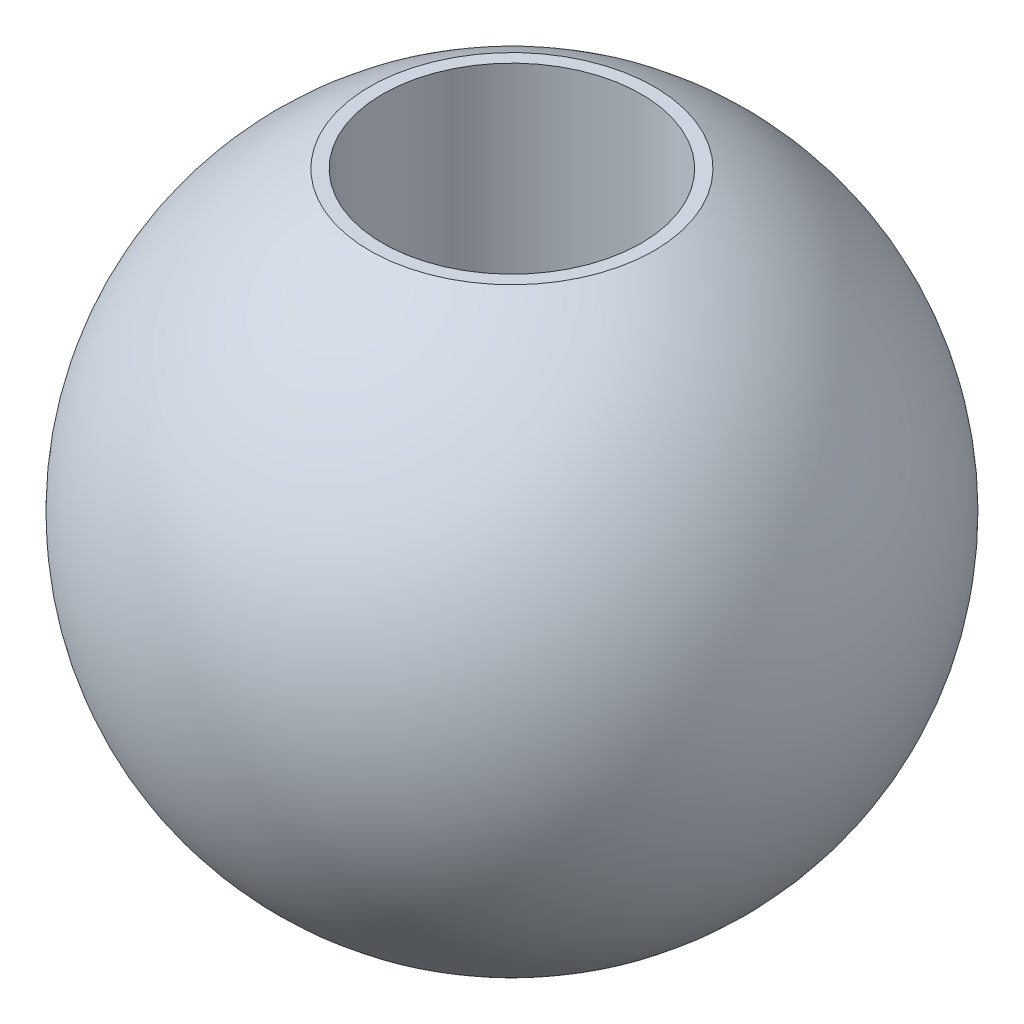
ISO-10303-21;
HEADER;
FILE_DESCRIPTION(('STEP AP214'),'2;1');
FILE_NAME('part.step','',(''),(''),'','','');
FILE_SCHEMA(('AUTOMOTIVE_DESIGN { 1 0 10303 214 1 1 1 1 }'));
ENDSEC;
DATA;
#1=APPLICATION_CONTEXT('core data for automotive mechanical design processes');
#2=APPLICATION_PROTOCOL_DEFINITION('international standard','automotive_design',2000,#1);
#3=PRODUCT_CONTEXT('',#1,'mechanical');
#4=PRODUCT('Part','Part','',(#3));
#5=PRODUCT_RELATED_PRODUCT_CATEGORY('part','',(#4));
#6=PRODUCT_DEFINITION_FORMATION('','',#4);
#7=PRODUCT_DEFINITION_CONTEXT('part definition',#1,'design');
#8=PRODUCT_DEFINITION('design','',#6,#7);
#9=PRODUCT_DEFINITION_SHAPE('','',#8);
#10=(LENGTH_UNIT() NAMED_UNIT(*) SI_UNIT(.MILLI.,.METRE.));
#11=(NAMED_UNIT(*) PLANE_ANGLE_UNIT() SI_UNIT($,.RADIAN.));
#12=(NAMED_UNIT(*) SI_UNIT($,.STERADIAN.) SOLID_ANGLE_UNIT());
#13=UNCERTAINTY_MEASURE_WITH_UNIT(LENGTH_MEASURE(1.E-05),#10,'distance_accuracy_value','');
#14=(GEOMETRIC_REPRESENTATION_CONTEXT(3) GLOBAL_UNCERTAINTY_ASSIGNED_CONTEXT((#13)) GLOBAL_UNIT_ASSIGNED_CONTEXT((#10,
#11,#12)) REPRESENTATION_CONTEXT('',''));
#15=CARTESIAN_POINT('',(0.,0.,0.));
#16=DIRECTION('',(0.,0.,1.));
#17=DIRECTION('',(1.,0.,0.));
#18=AXIS2_PLACEMENT_3D('',#15,#16,#17);
#19=CARTESIAN_POINT('',(0.,0.,0.));
#20=DIRECTION('',(0.,-1.,0.));
#21=DIRECTION('',(1.,0.,0.));
#22=AXIS2_PLACEMENT_3D('',#19,#20,#21);
#23=SPHERICAL_SURFACE('',#22,2.54950975679639);
#24=CARTESIAN_POINT('',(0.,2.29999999999997,0.));
#25=DIRECTION('',(0.,-1.,0.));
#26=DIRECTION('',(1.,0.,0.));
#27=AXIS2_PLACEMENT_3D('',#24,#25,#26);
#28=CIRCLE('',#27,1.10000000000001);
#29=CARTESIAN_POINT('',(1.10000000000006,2.29999999999997,0.));
#30=VERTEX_POINT('',#29);
#31=EDGE_CURVE('E46',#30,#30,#28,.T.);
#32=CARTESIAN_POINT('',(0.,-2.29999999999997,0.));
#33=DIRECTION('',(0.,-1.,0.));
#34=DIRECTION('',(1.,0.,0.));
#35=AXIS2_PLACEMENT_3D('',#32,#33,#34);
#36=CIRCLE('',#35,1.09999999999999);
#37=CARTESIAN_POINT('',(1.10000000000007,-2.29999999999997,0.));
#38=VERTEX_POINT('',#37);
#39=EDGE_CURVE('E10',#38,#38,#36,.T.);
#40=CARTESIAN_POINT('',(1.10000000000006,2.29999999999997,0.));
#41=CARTESIAN_POINT('',(1.15389326530189,2.27422907961271,0.));
#42=CARTESIAN_POINT('',(1.2068770975329,2.24655766779613,0.));
#43=CARTESIAN_POINT('',(1.31077227665758,2.18756475142487,0.));
#44=CARTESIAN_POINT('',(1.36168362355125,2.1562432468702,0.));
#45=CARTESIAN_POINT('',(1.46118021280557,2.09010103514332,0.));
#46=CARTESIAN_POINT('',(1.50976545516623,2.05528032797111,0.));
#47=CARTESIAN_POINT('',(1.60437044779513,1.982312714658,0.));
#48=CARTESIAN_POINT('',(1.65039019806338,1.9441658085171,0.));
#49=CARTESIAN_POINT('',(1.73963675523348,1.86473393496799,0.));
#50=CARTESIAN_POINT('',(1.78286356213534,1.82344896755979,0.));
#51=CARTESIAN_POINT('',(1.8663107728371,1.73794495518709,0.));
#52=CARTESIAN_POINT('',(1.90653117663701,1.6937259102226,0.));
#53=CARTESIAN_POINT('',(1.98376691754759,1.60257212520801,0.));
#54=CARTESIAN_POINT('',(2.02078225465826,1.55563738515792,0.));
#55=CARTESIAN_POINT('',(2.09142504287368,1.45928403042244,0.));
#56=CARTESIAN_POINT('',(2.12505249397842,1.40986541573707,0.));
#57=CARTESIAN_POINT('',(2.18875342017121,1.30878839360455,0.));
#58=CARTESIAN_POINT('',(2.21882689525926,1.2571299861574,0.));
#59=CARTESIAN_POINT('',(2.27527133385182,1.15182852471418,0.));
#60=CARTESIAN_POINT('',(2.30164229735634,1.09818547071811,0.));
#61=CARTESIAN_POINT('',(2.35055146400325,0.989179664270722,0.));
#62=CARTESIAN_POINT('',(2.37308966714565,0.933816911819411,0.));
#63=CARTESIAN_POINT('',(2.41422199473412,0.821645150439409,0.));
#64=CARTESIAN_POINT('',(2.43281611918018,0.764836141510718,0.));
#65=CARTESIAN_POINT('',(2.46596845120566,0.650052452319044,0.));
#66=CARTESIAN_POINT('',(2.48052665878507,0.592077772056061,0.));
#67=CARTESIAN_POINT('',(2.50553525269312,0.475249082710763,0.));
#68=CARTESIAN_POINT('',(2.51598563902175,0.416395073628448,0.));
#69=CARTESIAN_POINT('',(2.53272697496633,0.298098412246457,0.));
#70=CARTESIAN_POINT('',(2.53901792458228,0.238655759946781,0.));
#71=CARTESIAN_POINT('',(2.54740931549731,0.119475405098073,0.));
#72=CARTESIAN_POINT('',(2.54950975679639,0.0597377025490405,0.));
#73=CARTESIAN_POINT('',(2.54950975679639,-0.0597377025490238,0.));
#74=CARTESIAN_POINT('',(2.54740931549731,-0.119475405098056,0.));
#75=CARTESIAN_POINT('',(2.53901792458228,-0.238655759946764,0.));
#76=CARTESIAN_POINT('',(2.53272697496633,-0.298098412246441,0.));
#77=CARTESIAN_POINT('',(2.51598563902175,-0.416395073628432,0.));
#78=CARTESIAN_POINT('',(2.50553525269312,-0.475249082710747,0.));
#79=CARTESIAN_POINT('',(2.48052665878508,-0.592077772056045,0.));
#80=CARTESIAN_POINT('',(2.46596845120567,-0.650052452319028,0.));
#81=CARTESIAN_POINT('',(2.43281611918019,-0.764836141510702,0.));
#82=CARTESIAN_POINT('',(2.41422199473412,-0.821645150439393,0.));
#83=CARTESIAN_POINT('',(2.37308966714566,-0.933816911819396,0.));
#84=CARTESIAN_POINT('',(2.35055146400326,-0.989179664270707,0.));
#85=CARTESIAN_POINT('',(2.30164229735634,-1.09818547071809,0.));
#86=CARTESIAN_POINT('',(2.27527133385183,-1.15182852471417,0.));
#87=CARTESIAN_POINT('',(2.21882689525927,-1.25712998615739,0.));
#88=CARTESIAN_POINT('',(2.18875342017122,-1.30878839360453,0.));
#89=CARTESIAN_POINT('',(2.12505249397843,-1.40986541573706,0.));
#90=CARTESIAN_POINT('',(2.09142504287369,-1.45928403042243,0.));
#91=CARTESIAN_POINT('',(2.02078225465827,-1.5556373851579,0.));
#92=CARTESIAN_POINT('',(1.9837669175476,-1.602572125208,0.));
#93=CARTESIAN_POINT('',(1.90653117663702,-1.69372591022259,0.));
#94=CARTESIAN_POINT('',(1.86631077283711,-1.73794495518708,0.));
#95=CARTESIAN_POINT('',(1.78286356213535,-1.82344896755978,0.));
#96=CARTESIAN_POINT('',(1.73963675523349,-1.86473393496798,0.));
#97=CARTESIAN_POINT('',(1.65039019806339,-1.94416580851709,0.));
#98=CARTESIAN_POINT('',(1.60437044779514,-1.98231271465799,0.));
#99=CARTESIAN_POINT('',(1.50976545516624,-2.0552803279711,0.));
#100=CARTESIAN_POINT('',(1.46118021280559,-2.09010103514331,0.));
#101=CARTESIAN_POINT('',(1.36168362355126,-2.15624324687019,0.));
#102=CARTESIAN_POINT('',(1.31077227665759,-2.18756475142486,0.));
#103=CARTESIAN_POINT('',(1.20687709753292,-2.24655766779612,0.));
#104=CARTESIAN_POINT('',(1.15389326530191,-2.27422907961271,0.));
#105=CARTESIAN_POINT('',(1.10000000000007,-2.29999999999997,0.));
#106=B_SPLINE_CURVE_WITH_KNOTS('',3,(#40,#41,#42,#43,#44,#45,#46,#47,#48,#49,#50,#51,#52,#53,
#54,#55,#56,#57,#58,#59,#60,#61,#62,#63,#64,#65,#66,#67,#68,#69,#70,#71,#72,#73,#74,#75,#76,#77,
#78,#79,#80,#81,#82,#83,#84,#85,#86,#87,#88,#89,#90,#91,#92,#93,#94,#95,#96,#97,#98,#99,#100,
#101,#102,#103,#104,#105),.UNSPECIFIED.,.F.,.F.,(4,2,2,2,2,2,2,2,2,2,2,2,2,2,2,2,2,2,2,2,2,2,2,
2,2,2,2,2,2,2,2,2,4),(0.,0.179176237772063,0.358352475544126,0.537528713316189,
0.716704951088251,0.895881188860315,1.07505742663238,1.25423366440444,1.4334099021765,
1.61258613994857,1.79176237772063,1.97093861549269,2.15011485326475,2.32929109103682,
2.50846732880888,2.68764356658094,2.86681980435301,3.04599604212507,3.22517227989713,
3.40434851766919,3.58352475544126,3.76270099321332,3.94187723098538,4.12105346875744,
4.30022970652951,4.47940594430157,4.65858218207363,4.8377584198457,5.01693465761776,
5.19611089538982,5.37528713316188,5.55446337093395,5.73363960870601),.UNSPECIFIED.);
#107=EDGE_CURVE('BSEAM32',#30,#38,#106,.T.);
#108=ORIENTED_EDGE('',*,*,#31,.T.);
#109=ORIENTED_EDGE('',*,*,#39,.F.);
#110=ORIENTED_EDGE('',*,*,#107,.T.);
#111=ORIENTED_EDGE('',*,*,#107,.F.);
#112=EDGE_LOOP('',(#108,#110,#109,#111));
#113=FACE_BOUND('',#112,.T.);
#114=ADVANCED_FACE('F32',(#113),#23,.T.);
#115=CARTESIAN_POINT('',(1.,-2.3,0.));
#116=DIRECTION('',(0.,-1.,0.));
#117=DIRECTION('',(1.,0.,0.));
#118=AXIS2_PLACEMENT_3D('',#115,#116,#117);
#119=PLANE('',#118);
#120=ORIENTED_EDGE('',*,*,#39,.T.);
#121=EDGE_LOOP('',(#120));
#122=FACE_BOUND('',#121,.T.);
#123=CARTESIAN_POINT('',(0.,-2.29999999999997,0.));
#124=DIRECTION('',(0.,-1.,0.));
#125=DIRECTION('',(1.,0.,0.));
#126=AXIS2_PLACEMENT_3D('',#123,#124,#125);
#127=CIRCLE('',#126,0.999999999999992);
#128=CARTESIAN_POINT('',(1.,-2.29999999999997,0.));
#129=VERTEX_POINT('',#128);
#130=EDGE_CURVE('E38',#129,#129,#127,.T.);
#131=ORIENTED_EDGE('',*,*,#130,.F.);
#132=EDGE_LOOP('',(#131));
#133=FACE_BOUND('',#132,.T.);
#134=ADVANCED_FACE('F62',(#122,#133),#119,.T.);
#135=CARTESIAN_POINT('',(3.49148133884313E-12,-1000.,0.));
#136=DIRECTION('',(0.,-1.,0.));
#137=DIRECTION('',(1.,0.,0.));
#138=AXIS2_PLACEMENT_3D('',#135,#136,#137);
#139=CYLINDRICAL_SURFACE('',#138,1.);
#140=ORIENTED_EDGE('',*,*,#130,.T.);
#141=EDGE_LOOP('',(#140));
#142=FACE_BOUND('',#141,.T.);
#143=CARTESIAN_POINT('',(0.,2.29999999999997,0.));
#144=DIRECTION('',(0.,-1.,0.));
#145=DIRECTION('',(1.,0.,0.));
#146=AXIS2_PLACEMENT_3D('',#143,#144,#145);
#147=CIRCLE('',#146,1.00000000000001);
#148=CARTESIAN_POINT('',(1.,2.29999999999997,0.));
#149=VERTEX_POINT('',#148);
#150=EDGE_CURVE('E42',#149,#149,#147,.T.);
#151=ORIENTED_EDGE('',*,*,#150,.F.);
#152=EDGE_LOOP('',(#151));
#153=FACE_BOUND('',#152,.T.);
#154=ADVANCED_FACE('F56',(#142,#153),#139,.F.);
#155=CARTESIAN_POINT('',(1.1,2.3,0.));
#156=DIRECTION('',(0.,1.,0.));
#157=DIRECTION('',(-1.,0.,0.));
#158=AXIS2_PLACEMENT_3D('',#155,#156,#157);
#159=PLANE('',#158);
#160=ORIENTED_EDGE('',*,*,#150,.T.);
#161=EDGE_LOOP('',(#160));
#162=FACE_BOUND('',#161,.T.);
#163=ORIENTED_EDGE('',*,*,#31,.F.);
#164=EDGE_LOOP('',(#163));
#165=FACE_BOUND('',#164,.T.);
#166=ADVANCED_FACE('F54',(#162,#165),#159,.T.);
#167=CLOSED_SHELL('',(#114,#134,#154,#166));
#168=MANIFOLD_SOLID_BREP('B2',#167);
#169=ADVANCED_BREP_SHAPE_REPRESENTATION('',(#18,#168),#14);
#170=SHAPE_DEFINITION_REPRESENTATION(#9,#169);
ENDSEC;
END-ISO-10303-21;
